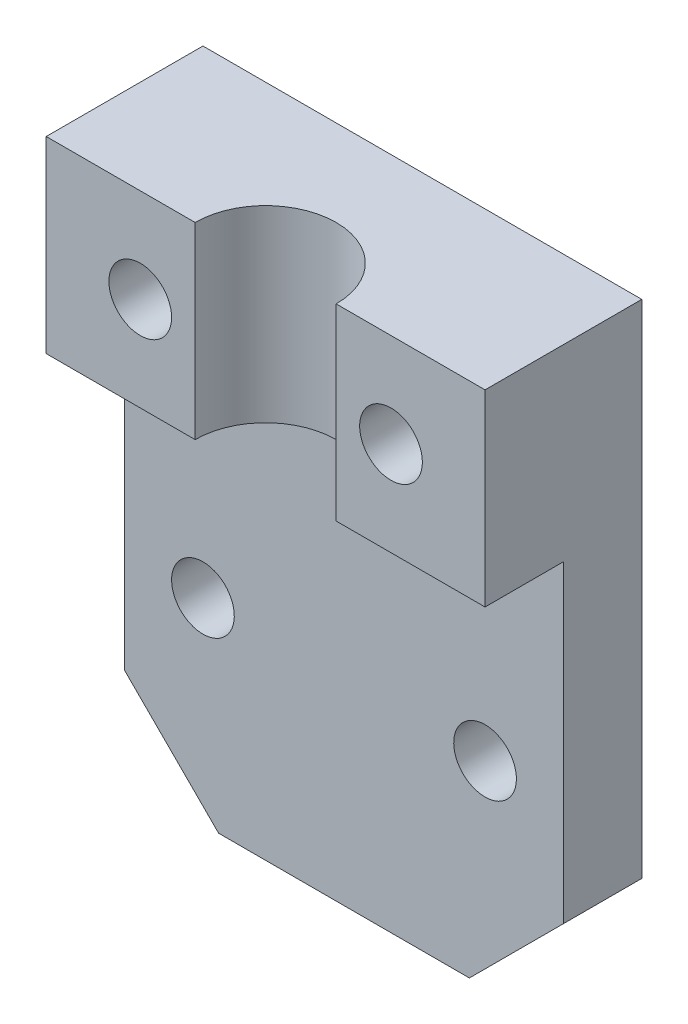
ISO-10303-21;
HEADER;
FILE_DESCRIPTION(('STEP AP214'),'2;1');
FILE_NAME('part.step','',(''),(''),'','','');
FILE_SCHEMA(('AUTOMOTIVE_DESIGN { 1 0 10303 214 1 1 1 1 }'));
ENDSEC;
DATA;
#1=APPLICATION_CONTEXT('core data for automotive mechanical design processes');
#2=APPLICATION_PROTOCOL_DEFINITION('international standard','automotive_design',2000,#1);
#3=PRODUCT_CONTEXT('',#1,'mechanical');
#4=PRODUCT('Part','Part','',(#3));
#5=PRODUCT_RELATED_PRODUCT_CATEGORY('part','',(#4));
#6=PRODUCT_DEFINITION_FORMATION('','',#4);
#7=PRODUCT_DEFINITION_CONTEXT('part definition',#1,'design');
#8=PRODUCT_DEFINITION('design','',#6,#7);
#9=PRODUCT_DEFINITION_SHAPE('','',#8);
#10=(LENGTH_UNIT() NAMED_UNIT(*) SI_UNIT(.MILLI.,.METRE.));
#11=(NAMED_UNIT(*) PLANE_ANGLE_UNIT() SI_UNIT($,.RADIAN.));
#12=(NAMED_UNIT(*) SI_UNIT($,.STERADIAN.) SOLID_ANGLE_UNIT());
#13=UNCERTAINTY_MEASURE_WITH_UNIT(LENGTH_MEASURE(1.E-05),#10,'distance_accuracy_value','');
#14=(GEOMETRIC_REPRESENTATION_CONTEXT(3) GLOBAL_UNCERTAINTY_ASSIGNED_CONTEXT((#13)) GLOBAL_UNIT_ASSIGNED_CONTEXT((#10,
#11,#12)) REPRESENTATION_CONTEXT('',''));
#15=CARTESIAN_POINT('',(0.,0.,0.));
#16=DIRECTION('',(0.,0.,1.));
#17=DIRECTION('',(1.,0.,0.));
#18=AXIS2_PLACEMENT_3D('',#15,#16,#17);
#19=CARTESIAN_POINT('',(1257.51094730863,975.612625701242,10.));
#20=DIRECTION('',(0.,0.,-1.));
#21=DIRECTION('',(-1.,0.,0.));
#22=AXIS2_PLACEMENT_3D('',#19,#20,#21);
#23=PLANE('',#22);
#24=CARTESIAN_POINT('',(1249.51094730863,1015.61262570124,10.));
#25=DIRECTION('',(0.,0.,1.));
#26=DIRECTION('',(1.,0.,0.));
#27=AXIS2_PLACEMENT_3D('',#24,#25,#26);
#28=CIRCLE('',#27,2.);
#29=CARTESIAN_POINT('',(1251.51094730863,1015.61262570124,10.));
#30=VERTEX_POINT('',#29);
#31=EDGE_CURVE('E214',#30,#30,#28,.T.);
#32=ORIENTED_EDGE('',*,*,#31,.F.);
#33=EDGE_LOOP('',(#32));
#34=FACE_BOUND('',#33,.T.);
#35=DIRECTION('',(-1.,0.,0.));
#36=VECTOR('',#35,1.);
#37=CARTESIAN_POINT('',(1271.51194730863,1009.61262570124,10.));
#38=LINE('',#37,#36);
#39=CARTESIAN_POINT('',(1253.01094730863,1009.61262570124,10.));
#40=VERTEX_POINT('',#39);
#41=CARTESIAN_POINT('',(1243.51094730863,1009.61262570124,10.));
#42=VERTEX_POINT('',#41);
#43=EDGE_CURVE('E53',#40,#42,#38,.T.);
#44=ORIENTED_EDGE('',*,*,#43,.F.);
#45=DIRECTION('',(0.,1.,0.));
#46=VECTOR('',#45,1.);
#47=CARTESIAN_POINT('',(1253.01094730863,1001.61262570124,10.));
#48=LINE('',#47,#46);
#49=CARTESIAN_POINT('',(1253.01094730863,1021.61262570124,10.));
#50=VERTEX_POINT('',#49);
#51=EDGE_CURVE('E47',#40,#50,#48,.T.);
#52=ORIENTED_EDGE('',*,*,#51,.T.);
#53=DIRECTION('',(-1.,0.,0.));
#54=VECTOR('',#53,1.);
#55=CARTESIAN_POINT('',(1243.51094730863,1021.61262570124,10.));
#56=LINE('',#55,#54);
#57=CARTESIAN_POINT('',(1243.51094730863,1021.61262570124,10.));
#58=VERTEX_POINT('',#57);
#59=EDGE_CURVE('E123',#50,#58,#56,.T.);
#60=ORIENTED_EDGE('',*,*,#59,.T.);
#61=DIRECTION('',(0.,-1.,0.));
#62=VECTOR('',#61,1.);
#63=CARTESIAN_POINT('',(1243.51094730863,989.612625701244,10.));
#64=LINE('',#63,#62);
#65=EDGE_CURVE('E129',#58,#42,#64,.T.);
#66=ORIENTED_EDGE('',*,*,#65,.T.);
#67=EDGE_LOOP('',(#44,#52,#60,#66));
#68=FACE_BOUND('',#67,.T.);
#69=ADVANCED_FACE('F32',(#34,#68),#23,.F.);
#70=CARTESIAN_POINT('',(1265.51094730863,1015.61262570124,10.));
#71=DIRECTION('',(0.,0.,1.));
#72=DIRECTION('',(1.,0.,0.));
#73=AXIS2_PLACEMENT_3D('',#70,#71,#72);
#74=CIRCLE('',#73,2.);
#75=CARTESIAN_POINT('',(1267.51094730863,1015.61262570124,10.));
#76=VERTEX_POINT('',#75);
#77=EDGE_CURVE('E141',#76,#76,#74,.T.);
#78=ORIENTED_EDGE('',*,*,#77,.F.);
#79=EDGE_LOOP('',(#78));
#80=FACE_BOUND('',#79,.T.);
#81=CARTESIAN_POINT('',(1271.51094730863,1021.61262570124,10.));
#82=VERTEX_POINT('',#81);
#83=CARTESIAN_POINT('',(1262.01094730863,1021.61262570124,10.));
#84=VERTEX_POINT('',#83);
#85=EDGE_CURVE('E121',#82,#84,#56,.T.);
#86=ORIENTED_EDGE('',*,*,#85,.T.);
#87=DIRECTION('',(0.,1.,0.));
#88=VECTOR('',#87,1.);
#89=CARTESIAN_POINT('',(1262.01094730863,1001.61262570124,10.));
#90=LINE('',#89,#88);
#91=CARTESIAN_POINT('',(1262.01094730863,1009.61262570124,10.));
#92=VERTEX_POINT('',#91);
#93=EDGE_CURVE('E107',#84,#92,#90,.F.);
#94=ORIENTED_EDGE('',*,*,#93,.T.);
#95=CARTESIAN_POINT('',(1271.51094730863,1009.61262570124,10.));
#96=VERTEX_POINT('',#95);
#97=EDGE_CURVE('E330',#96,#92,#38,.T.);
#98=ORIENTED_EDGE('',*,*,#97,.F.);
#99=DIRECTION('',(0.,1.,0.));
#100=VECTOR('',#99,1.);
#101=CARTESIAN_POINT('',(1271.51094730863,989.612625701242,10.));
#102=LINE('',#101,#100);
#103=EDGE_CURVE('E127',#96,#82,#102,.T.);
#104=ORIENTED_EDGE('',*,*,#103,.T.);
#105=EDGE_LOOP('',(#86,#94,#98,#104));
#106=FACE_BOUND('',#105,.T.);
#107=ADVANCED_FACE('F125',(#80,#106),#23,.F.);
#108=CARTESIAN_POINT('',(1257.51094730863,975.612625701242,0.));
#109=DIRECTION('',(0.,0.,-1.));
#110=DIRECTION('',(-1.,0.,0.));
#111=AXIS2_PLACEMENT_3D('',#108,#109,#110);
#112=PLANE('',#111);
#113=CARTESIAN_POINT('',(1248.51094730863,996.112625701243,0.));
#114=DIRECTION('',(0.,0.,1.));
#115=DIRECTION('',(1.,0.,0.));
#116=AXIS2_PLACEMENT_3D('',#113,#114,#115);
#117=CIRCLE('',#116,2.);
#118=CARTESIAN_POINT('',(1250.51094730863,996.112625701243,0.));
#119=VERTEX_POINT('',#118);
#120=EDGE_CURVE('E210',#119,#119,#117,.T.);
#121=ORIENTED_EDGE('',*,*,#120,.T.);
#122=EDGE_LOOP('',(#121));
#123=FACE_BOUND('',#122,.T.);
#124=CARTESIAN_POINT('',(1265.51094730863,1015.61262570124,0.));
#125=DIRECTION('',(0.,0.,1.));
#126=DIRECTION('',(1.,0.,0.));
#127=AXIS2_PLACEMENT_3D('',#124,#125,#126);
#128=CIRCLE('',#127,2.);
#129=CARTESIAN_POINT('',(1267.51094730863,1015.61262570124,0.));
#130=VERTEX_POINT('',#129);
#131=EDGE_CURVE('E217',#130,#130,#128,.T.);
#132=ORIENTED_EDGE('',*,*,#131,.T.);
#133=EDGE_LOOP('',(#132));
#134=FACE_BOUND('',#133,.T.);
#135=DIRECTION('',(0.707106781186495,-0.7071067811866,0.));
#136=VECTOR('',#135,1.);
#137=CARTESIAN_POINT('',(1249.51094730863,983.612625701243,0.));
#138=LINE('',#137,#136);
#139=CARTESIAN_POINT('',(1243.51094730863,989.612625701244,0.));
#140=VERTEX_POINT('',#139);
#141=CARTESIAN_POINT('',(1249.51094730863,983.612625701243,0.));
#142=VERTEX_POINT('',#141);
#143=EDGE_CURVE('E137',#140,#142,#138,.T.);
#144=ORIENTED_EDGE('',*,*,#143,.F.);
#145=DIRECTION('',(0.,-1.,0.));
#146=VECTOR('',#145,1.);
#147=CARTESIAN_POINT('',(1243.51094730863,989.612625701244,0.));
#148=LINE('',#147,#146);
#149=CARTESIAN_POINT('',(1243.51094730863,1021.61262570124,0.));
#150=VERTEX_POINT('',#149);
#151=EDGE_CURVE('E151',#150,#140,#148,.T.);
#152=ORIENTED_EDGE('',*,*,#151,.F.);
#153=DIRECTION('',(-1.,0.,0.));
#154=VECTOR('',#153,1.);
#155=CARTESIAN_POINT('',(1243.51094730863,1021.61262570124,0.));
#156=LINE('',#155,#154);
#157=CARTESIAN_POINT('',(1271.51094730863,1021.61262570124,0.));
#158=VERTEX_POINT('',#157);
#159=EDGE_CURVE('E149',#158,#150,#156,.T.);
#160=ORIENTED_EDGE('',*,*,#159,.F.);
#161=DIRECTION('',(0.,1.,0.));
#162=VECTOR('',#161,1.);
#163=CARTESIAN_POINT('',(1271.51094730863,989.612625701242,0.));
#164=LINE('',#163,#162);
#165=CARTESIAN_POINT('',(1271.51094730863,989.612625701242,0.));
#166=VERTEX_POINT('',#165);
#167=EDGE_CURVE('E147',#166,#158,#164,.T.);
#168=ORIENTED_EDGE('',*,*,#167,.F.);
#169=DIRECTION('',(0.70710678118658,0.707106781186515,0.));
#170=VECTOR('',#169,1.);
#171=CARTESIAN_POINT('',(1265.51094730863,983.612625701243,0.));
#172=LINE('',#171,#170);
#173=CARTESIAN_POINT('',(1265.51094730863,983.612625701243,0.));
#174=VERTEX_POINT('',#173);
#175=EDGE_CURVE('E144',#174,#166,#172,.T.);
#176=ORIENTED_EDGE('',*,*,#175,.F.);
#177=DIRECTION('',(1.,0.,0.));
#178=VECTOR('',#177,1.);
#179=CARTESIAN_POINT('',(1249.51094730863,983.612625701243,0.));
#180=LINE('',#179,#178);
#181=EDGE_CURVE('E140',#142,#174,#180,.T.);
#182=ORIENTED_EDGE('',*,*,#181,.F.);
#183=EDGE_LOOP('',(#144,#152,#160,#168,#176,#182));
#184=FACE_BOUND('',#183,.T.);
#185=CARTESIAN_POINT('',(1249.51094730863,1015.61262570124,0.));
#186=DIRECTION('',(0.,0.,1.));
#187=DIRECTION('',(1.,0.,0.));
#188=AXIS2_PLACEMENT_3D('',#185,#186,#187);
#189=CIRCLE('',#188,2.);
#190=CARTESIAN_POINT('',(1251.51094730863,1015.61262570124,0.));
#191=VERTEX_POINT('',#190);
#192=EDGE_CURVE('E213',#191,#191,#189,.T.);
#193=ORIENTED_EDGE('',*,*,#192,.T.);
#194=EDGE_LOOP('',(#193));
#195=FACE_BOUND('',#194,.T.);
#196=CARTESIAN_POINT('',(1266.51094730863,996.112625701243,0.));
#197=DIRECTION('',(0.,0.,1.));
#198=DIRECTION('',(1.,0.,0.));
#199=AXIS2_PLACEMENT_3D('',#196,#197,#198);
#200=CIRCLE('',#199,2.);
#201=CARTESIAN_POINT('',(1268.51094730863,996.112625701243,0.));
#202=VERTEX_POINT('',#201);
#203=EDGE_CURVE('E200',#202,#202,#200,.T.);
#204=ORIENTED_EDGE('',*,*,#203,.T.);
#205=EDGE_LOOP('',(#204));
#206=FACE_BOUND('',#205,.T.);
#207=ADVANCED_FACE('F175',(#123,#134,#184,#195,#206),#112,.T.);
#208=CARTESIAN_POINT('',(1249.51094730863,983.612625701243,10.));
#209=DIRECTION('',(0.7071067811866,0.707106781186495,0.));
#210=DIRECTION('',(-0.707106781186495,0.7071067811866,0.));
#211=AXIS2_PLACEMENT_3D('',#208,#209,#210);
#212=PLANE('',#211);
#213=DIRECTION('',(0.,0.,-1.));
#214=VECTOR('',#213,1.);
#215=CARTESIAN_POINT('',(1249.51094730863,983.612625701243,10.));
#216=LINE('',#215,#214);
#217=CARTESIAN_POINT('',(1249.51094730863,983.612625701243,5.));
#218=VERTEX_POINT('',#217);
#219=EDGE_CURVE('E40',#218,#142,#216,.T.);
#220=ORIENTED_EDGE('',*,*,#219,.F.);
#221=DIRECTION('',(0.707106781186495,-0.7071067811866,0.));
#222=VECTOR('',#221,1.);
#223=CARTESIAN_POINT('',(1247.51144730863,985.612125701245,5.));
#224=LINE('',#223,#222);
#225=CARTESIAN_POINT('',(1243.51094730863,989.612625701244,5.));
#226=VERTEX_POINT('',#225);
#227=EDGE_CURVE('E180',#226,#218,#224,.T.);
#228=ORIENTED_EDGE('',*,*,#227,.F.);
#229=DIRECTION('',(0.,0.,-1.));
#230=VECTOR('',#229,1.);
#231=CARTESIAN_POINT('',(1243.51094730863,989.612625701244,10.));
#232=LINE('',#231,#230);
#233=EDGE_CURVE('E132',#226,#140,#232,.T.);
#234=ORIENTED_EDGE('',*,*,#233,.T.);
#235=ORIENTED_EDGE('',*,*,#143,.T.);
#236=EDGE_LOOP('',(#220,#228,#234,#235));
#237=FACE_BOUND('',#236,.T.);
#238=ADVANCED_FACE('F34',(#237),#212,.F.);
#239=CARTESIAN_POINT('',(1249.51094730863,983.612625701243,10.));
#240=DIRECTION('',(0.,1.,0.));
#241=DIRECTION('',(0.,0.,1.));
#242=AXIS2_PLACEMENT_3D('',#239,#240,#241);
#243=PLANE('',#242);
#244=DIRECTION('',(0.,0.,-1.));
#245=VECTOR('',#244,1.);
#246=CARTESIAN_POINT('',(1265.51094730863,983.612625701243,10.));
#247=LINE('',#246,#245);
#248=CARTESIAN_POINT('',(1265.51094730863,983.612625701243,5.));
#249=VERTEX_POINT('',#248);
#250=EDGE_CURVE('E162',#249,#174,#247,.T.);
#251=ORIENTED_EDGE('',*,*,#250,.F.);
#252=DIRECTION('',(1.,0.,0.));
#253=VECTOR('',#252,1.);
#254=CARTESIAN_POINT('',(1271.51194730863,983.612625701243,5.));
#255=LINE('',#254,#253);
#256=EDGE_CURVE('E170',#218,#249,#255,.T.);
#257=ORIENTED_EDGE('',*,*,#256,.F.);
#258=ORIENTED_EDGE('',*,*,#219,.T.);
#259=ORIENTED_EDGE('',*,*,#181,.T.);
#260=EDGE_LOOP('',(#251,#257,#258,#259));
#261=FACE_BOUND('',#260,.T.);
#262=ADVANCED_FACE('F168',(#261),#243,.F.);
#263=CARTESIAN_POINT('',(1265.51094730863,983.612625701243,10.));
#264=DIRECTION('',(-0.707106781186515,0.70710678118658,0.));
#265=DIRECTION('',(-0.70710678118658,-0.707106781186515,0.));
#266=AXIS2_PLACEMENT_3D('',#263,#264,#265);
#267=PLANE('',#266);
#268=DIRECTION('',(0.,0.,-1.));
#269=VECTOR('',#268,1.);
#270=CARTESIAN_POINT('',(1271.51094730863,989.612625701242,10.));
#271=LINE('',#270,#269);
#272=CARTESIAN_POINT('',(1271.51094730863,989.612625701242,5.));
#273=VERTEX_POINT('',#272);
#274=EDGE_CURVE('E160',#273,#166,#271,.T.);
#275=ORIENTED_EDGE('',*,*,#274,.F.);
#276=DIRECTION('',(0.70710678118658,0.707106781186515,0.));
#277=VECTOR('',#276,1.);
#278=CARTESIAN_POINT('',(1281.51144730863,999.613125701241,5.));
#279=LINE('',#278,#277);
#280=EDGE_CURVE('E196',#249,#273,#279,.T.);
#281=ORIENTED_EDGE('',*,*,#280,.F.);
#282=ORIENTED_EDGE('',*,*,#250,.T.);
#283=ORIENTED_EDGE('',*,*,#175,.T.);
#284=EDGE_LOOP('',(#275,#281,#282,#283));
#285=FACE_BOUND('',#284,.T.);
#286=ADVANCED_FACE('F195',(#285),#267,.F.);
#287=CARTESIAN_POINT('',(1271.51094730863,989.612625701242,10.));
#288=DIRECTION('',(-1.,0.,0.));
#289=DIRECTION('',(0.,0.,1.));
#290=AXIS2_PLACEMENT_3D('',#287,#288,#289);
#291=PLANE('',#290);
#292=DIRECTION('',(0.,0.,1.));
#293=VECTOR('',#292,1.);
#294=CARTESIAN_POINT('',(1271.51094730863,1009.61262570124,11.5058097312999));
#295=LINE('',#294,#293);
#296=CARTESIAN_POINT('',(1271.51094730863,1009.61262570124,5.));
#297=VERTEX_POINT('',#296);
#298=EDGE_CURVE('E198',#297,#96,#295,.T.);
#299=ORIENTED_EDGE('',*,*,#298,.F.);
#300=DIRECTION('',(0.,1.,0.));
#301=VECTOR('',#300,1.);
#302=CARTESIAN_POINT('',(1271.51094730863,1009.61262570124,5.));
#303=LINE('',#302,#301);
#304=EDGE_CURVE('E192',#273,#297,#303,.T.);
#305=ORIENTED_EDGE('',*,*,#304,.F.);
#306=ORIENTED_EDGE('',*,*,#274,.T.);
#307=ORIENTED_EDGE('',*,*,#167,.T.);
#308=DIRECTION('',(0.,0.,-1.));
#309=VECTOR('',#308,1.);
#310=CARTESIAN_POINT('',(1271.51094730863,1021.61262570124,10.));
#311=LINE('',#310,#309);
#312=EDGE_CURVE('E158',#82,#158,#311,.T.);
#313=ORIENTED_EDGE('',*,*,#312,.F.);
#314=ORIENTED_EDGE('',*,*,#103,.F.);
#315=EDGE_LOOP('',(#299,#305,#306,#307,#313,#314));
#316=FACE_BOUND('',#315,.T.);
#317=ADVANCED_FACE('F188',(#316),#291,.F.);
#318=CARTESIAN_POINT('',(1243.51094730863,1021.61262570124,10.));
#319=DIRECTION('',(0.,-1.,0.));
#320=DIRECTION('',(0.,0.,-1.));
#321=AXIS2_PLACEMENT_3D('',#318,#319,#320);
#322=PLANE('',#321);
#323=ORIENTED_EDGE('',*,*,#59,.F.);
#324=CARTESIAN_POINT('',(1257.51094730863,1021.61262570124,10.));
#325=DIRECTION('',(0.,1.,0.));
#326=DIRECTION('',(0.,0.,1.));
#327=AXIS2_PLACEMENT_3D('',#324,#325,#326);
#328=CIRCLE('',#327,4.50000000000001);
#329=EDGE_CURVE('E110',#84,#50,#328,.T.);
#330=ORIENTED_EDGE('',*,*,#329,.F.);
#331=ORIENTED_EDGE('',*,*,#85,.F.);
#332=ORIENTED_EDGE('',*,*,#312,.T.);
#333=ORIENTED_EDGE('',*,*,#159,.T.);
#334=DIRECTION('',(0.,0.,-1.));
#335=VECTOR('',#334,1.);
#336=CARTESIAN_POINT('',(1243.51094730863,1021.61262570124,10.));
#337=LINE('',#336,#335);
#338=EDGE_CURVE('E155',#58,#150,#337,.T.);
#339=ORIENTED_EDGE('',*,*,#338,.F.);
#340=EDGE_LOOP('',(#323,#330,#331,#332,#333,#339));
#341=FACE_BOUND('',#340,.T.);
#342=ADVANCED_FACE('F119',(#341),#322,.F.);
#343=CARTESIAN_POINT('',(1243.51094730863,989.612625701244,10.));
#344=DIRECTION('',(1.,0.,0.));
#345=DIRECTION('',(0.,0.,-1.));
#346=AXIS2_PLACEMENT_3D('',#343,#344,#345);
#347=PLANE('',#346);
#348=ORIENTED_EDGE('',*,*,#233,.F.);
#349=DIRECTION('',(0.,-1.,0.));
#350=VECTOR('',#349,1.);
#351=CARTESIAN_POINT('',(1243.51094730863,1009.61262570124,5.));
#352=LINE('',#351,#350);
#353=CARTESIAN_POINT('',(1243.51094730863,1009.61262570124,5.));
#354=VERTEX_POINT('',#353);
#355=EDGE_CURVE('E326',#354,#226,#352,.T.);
#356=ORIENTED_EDGE('',*,*,#355,.F.);
#357=DIRECTION('',(0.,0.,-1.));
#358=VECTOR('',#357,1.);
#359=CARTESIAN_POINT('',(1243.51094730863,1009.61262570124,11.5058097312999));
#360=LINE('',#359,#358);
#361=EDGE_CURVE('E324',#42,#354,#360,.T.);
#362=ORIENTED_EDGE('',*,*,#361,.F.);
#363=ORIENTED_EDGE('',*,*,#65,.F.);
#364=ORIENTED_EDGE('',*,*,#338,.T.);
#365=ORIENTED_EDGE('',*,*,#151,.T.);
#366=EDGE_LOOP('',(#348,#356,#362,#363,#364,#365));
#367=FACE_BOUND('',#366,.T.);
#368=ADVANCED_FACE('F183',(#367),#347,.F.);
#369=CARTESIAN_POINT('',(1265.51094730863,1015.61262570124,10.));
#370=DIRECTION('',(0.,0.,-1.));
#371=DIRECTION('',(-1.,0.,0.));
#372=AXIS2_PLACEMENT_3D('',#369,#370,#371);
#373=CYLINDRICAL_SURFACE('',#372,2.);
#374=ORIENTED_EDGE('',*,*,#77,.T.);
#375=EDGE_LOOP('',(#374));
#376=FACE_BOUND('',#375,.T.);
#377=ORIENTED_EDGE('',*,*,#131,.F.);
#378=EDGE_LOOP('',(#377));
#379=FACE_BOUND('',#378,.T.);
#380=ADVANCED_FACE('F225',(#376,#379),#373,.F.);
#381=CARTESIAN_POINT('',(1249.51094730863,1015.61262570124,10.));
#382=DIRECTION('',(0.,0.,-1.));
#383=DIRECTION('',(-1.,0.,0.));
#384=AXIS2_PLACEMENT_3D('',#381,#382,#383);
#385=CYLINDRICAL_SURFACE('',#384,2.);
#386=ORIENTED_EDGE('',*,*,#31,.T.);
#387=EDGE_LOOP('',(#386));
#388=FACE_BOUND('',#387,.T.);
#389=ORIENTED_EDGE('',*,*,#192,.F.);
#390=EDGE_LOOP('',(#389));
#391=FACE_BOUND('',#390,.T.);
#392=ADVANCED_FACE('F227',(#388,#391),#385,.F.);
#393=CARTESIAN_POINT('',(1248.51094730863,996.112625701243,10.));
#394=DIRECTION('',(0.,0.,-1.));
#395=DIRECTION('',(-1.,0.,0.));
#396=AXIS2_PLACEMENT_3D('',#393,#394,#395);
#397=CYLINDRICAL_SURFACE('',#396,2.);
#398=CARTESIAN_POINT('',(1248.51094730863,996.112625701243,5.));
#399=DIRECTION('',(0.,0.,-1.));
#400=DIRECTION('',(0.,1.,0.));
#401=AXIS2_PLACEMENT_3D('',#398,#399,#400);
#402=CIRCLE('',#401,2.);
#403=CARTESIAN_POINT('',(1248.51094730863,998.112625701243,5.));
#404=VERTEX_POINT('',#403);
#405=EDGE_CURVE('E205',#404,#404,#402,.F.);
#406=ORIENTED_EDGE('',*,*,#405,.T.);
#407=EDGE_LOOP('',(#406));
#408=FACE_BOUND('',#407,.T.);
#409=ORIENTED_EDGE('',*,*,#120,.F.);
#410=EDGE_LOOP('',(#409));
#411=FACE_BOUND('',#410,.T.);
#412=ADVANCED_FACE('F234',(#408,#411),#397,.F.);
#413=CARTESIAN_POINT('',(1266.51094730863,996.112625701243,10.));
#414=DIRECTION('',(0.,0.,-1.));
#415=DIRECTION('',(-1.,0.,0.));
#416=AXIS2_PLACEMENT_3D('',#413,#414,#415);
#417=CYLINDRICAL_SURFACE('',#416,2.);
#418=CARTESIAN_POINT('',(1266.51094730863,996.112625701243,5.));
#419=DIRECTION('',(0.,0.,-1.));
#420=DIRECTION('',(0.,1.,0.));
#421=AXIS2_PLACEMENT_3D('',#418,#419,#420);
#422=CIRCLE('',#421,2.);
#423=CARTESIAN_POINT('',(1266.51094730863,998.112625701243,5.));
#424=VERTEX_POINT('',#423);
#425=EDGE_CURVE('E325',#424,#424,#422,.F.);
#426=ORIENTED_EDGE('',*,*,#425,.T.);
#427=EDGE_LOOP('',(#426));
#428=FACE_BOUND('',#427,.T.);
#429=ORIENTED_EDGE('',*,*,#203,.F.);
#430=EDGE_LOOP('',(#429));
#431=FACE_BOUND('',#430,.T.);
#432=ADVANCED_FACE('F309',(#428,#431),#417,.F.);
#433=CARTESIAN_POINT('',(1271.51194730863,1009.61262570124,5.));
#434=DIRECTION('',(0.,0.,-1.));
#435=DIRECTION('',(0.,1.,0.));
#436=AXIS2_PLACEMENT_3D('',#433,#434,#435);
#437=PLANE('',#436);
#438=ORIENTED_EDGE('',*,*,#425,.F.);
#439=EDGE_LOOP('',(#438));
#440=FACE_BOUND('',#439,.T.);
#441=ORIENTED_EDGE('',*,*,#405,.F.);
#442=EDGE_LOOP('',(#441));
#443=FACE_BOUND('',#442,.T.);
#444=ORIENTED_EDGE('',*,*,#227,.T.);
#445=ORIENTED_EDGE('',*,*,#256,.T.);
#446=ORIENTED_EDGE('',*,*,#280,.T.);
#447=ORIENTED_EDGE('',*,*,#304,.T.);
#448=DIRECTION('',(-1.,0.,0.));
#449=VECTOR('',#448,1.);
#450=CARTESIAN_POINT('',(1271.51194730863,1009.61262570124,5.));
#451=LINE('',#450,#449);
#452=EDGE_CURVE('E202',#297,#354,#451,.T.);
#453=ORIENTED_EDGE('',*,*,#452,.T.);
#454=ORIENTED_EDGE('',*,*,#355,.T.);
#455=EDGE_LOOP('',(#444,#445,#446,#447,#453,#454));
#456=FACE_BOUND('',#455,.T.);
#457=ADVANCED_FACE('F292',(#440,#443,#456),#437,.F.);
#458=CARTESIAN_POINT('',(1271.51194730863,1009.61262570124,11.5058097312999));
#459=DIRECTION('',(0.,1.,0.));
#460=DIRECTION('',(0.,0.,1.));
#461=AXIS2_PLACEMENT_3D('',#458,#459,#460);
#462=PLANE('',#461);
#463=ORIENTED_EDGE('',*,*,#97,.T.);
#464=CARTESIAN_POINT('',(1257.51094730863,1009.61262570124,10.));
#465=DIRECTION('',(0.,1.,0.));
#466=DIRECTION('',(0.,0.,1.));
#467=AXIS2_PLACEMENT_3D('',#464,#465,#466);
#468=CIRCLE('',#467,4.50000000000001);
#469=EDGE_CURVE('E11',#92,#40,#468,.T.);
#470=ORIENTED_EDGE('',*,*,#469,.T.);
#471=ORIENTED_EDGE('',*,*,#43,.T.);
#472=ORIENTED_EDGE('',*,*,#361,.T.);
#473=ORIENTED_EDGE('',*,*,#452,.F.);
#474=ORIENTED_EDGE('',*,*,#298,.T.);
#475=EDGE_LOOP('',(#463,#470,#471,#472,#473,#474));
#476=FACE_BOUND('',#475,.T.);
#477=ADVANCED_FACE('F287',(#476),#462,.F.);
#478=CARTESIAN_POINT('',(1257.51094730863,1001.61262570124,10.));
#479=DIRECTION('',(0.,1.,0.));
#480=DIRECTION('',(0.,0.,1.));
#481=AXIS2_PLACEMENT_3D('',#478,#479,#480);
#482=CYLINDRICAL_SURFACE('',#481,4.50000000000001);
#483=ORIENTED_EDGE('',*,*,#469,.F.);
#484=ORIENTED_EDGE('',*,*,#93,.F.);
#485=ORIENTED_EDGE('',*,*,#329,.T.);
#486=ORIENTED_EDGE('',*,*,#51,.F.);
#487=EDGE_LOOP('',(#483,#484,#485,#486));
#488=FACE_BOUND('',#487,.T.);
#489=ADVANCED_FACE('F109',(#488),#482,.F.);
#490=CLOSED_SHELL('',(#69,#107,#207,#238,#262,#286,#317,#342,#368,#380,#392,#412,#432,#457,#477,#489));
#491=MANIFOLD_SOLID_BREP('B2',#490);
#492=ADVANCED_BREP_SHAPE_REPRESENTATION('',(#18,#491),#14);
#493=SHAPE_DEFINITION_REPRESENTATION(#9,#492);
ENDSEC;
END-ISO-10303-21;
